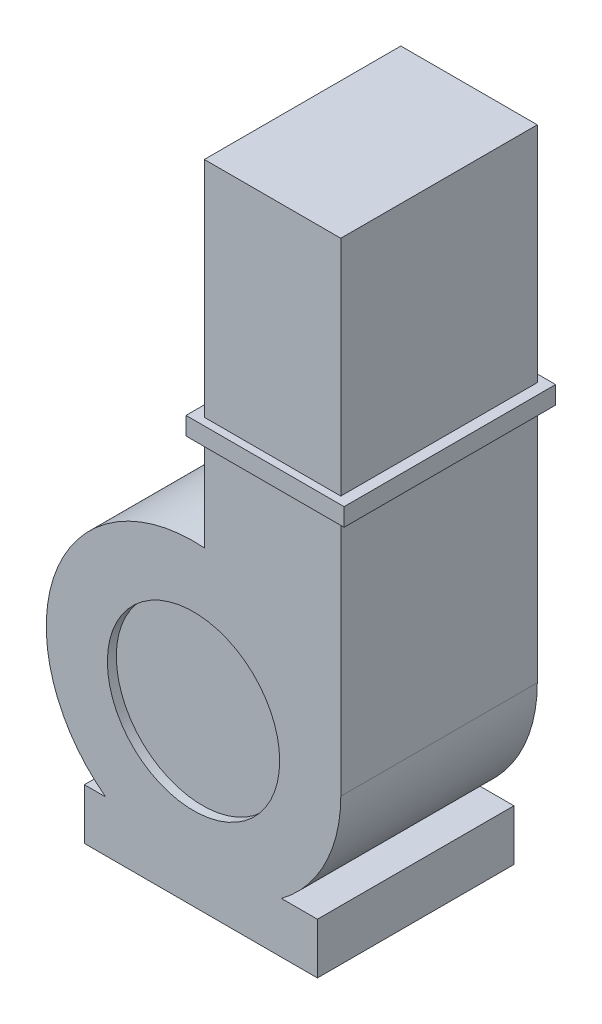
ISO-10303-21;
HEADER;
FILE_DESCRIPTION(('STEP AP214'),'2;1');
FILE_NAME('part.step','',(''),(''),'','','');
FILE_SCHEMA(('AUTOMOTIVE_DESIGN { 1 0 10303 214 1 1 1 1 }'));
ENDSEC;
DATA;
#1=APPLICATION_CONTEXT('core data for automotive mechanical design processes');
#2=APPLICATION_PROTOCOL_DEFINITION('international standard','automotive_design',2000,#1);
#3=PRODUCT_CONTEXT('',#1,'mechanical');
#4=PRODUCT('Part','Part','',(#3));
#5=PRODUCT_RELATED_PRODUCT_CATEGORY('part','',(#4));
#6=PRODUCT_DEFINITION_FORMATION('','',#4);
#7=PRODUCT_DEFINITION_CONTEXT('part definition',#1,'design');
#8=PRODUCT_DEFINITION('design','',#6,#7);
#9=PRODUCT_DEFINITION_SHAPE('','',#8);
#10=(LENGTH_UNIT() NAMED_UNIT(*) SI_UNIT(.MILLI.,.METRE.));
#11=(NAMED_UNIT(*) PLANE_ANGLE_UNIT() SI_UNIT($,.RADIAN.));
#12=(NAMED_UNIT(*) SI_UNIT($,.STERADIAN.) SOLID_ANGLE_UNIT());
#13=UNCERTAINTY_MEASURE_WITH_UNIT(LENGTH_MEASURE(1.E-05),#10,'distance_accuracy_value','');
#14=(GEOMETRIC_REPRESENTATION_CONTEXT(3) GLOBAL_UNCERTAINTY_ASSIGNED_CONTEXT((#13)) GLOBAL_UNIT_ASSIGNED_CONTEXT((#10,
#11,#12)) REPRESENTATION_CONTEXT('',''));
#15=CARTESIAN_POINT('',(0.,0.,0.));
#16=DIRECTION('',(0.,0.,1.));
#17=DIRECTION('',(1.,0.,0.));
#18=AXIS2_PLACEMENT_3D('',#15,#16,#17);
#19=CARTESIAN_POINT('',(16.4876424286667,45.5916168664445,11.));
#20=DIRECTION('',(-1.,0.,0.));
#21=DIRECTION('',(0.,0.,1.));
#22=AXIS2_PLACEMENT_3D('',#19,#20,#21);
#23=PLANE('',#22);
#24=DIRECTION('',(0.,0.,-1.));
#25=VECTOR('',#24,1.);
#26=CARTESIAN_POINT('',(16.4876424286667,20.5916168664445,11.));
#27=LINE('',#26,#25);
#28=CARTESIAN_POINT('',(16.4876424286667,20.5916168664445,11.));
#29=VERTEX_POINT('',#28);
#30=CARTESIAN_POINT('',(16.4876424286667,20.5916168664445,-11.));
#31=VERTEX_POINT('',#30);
#32=EDGE_CURVE('E113',#29,#31,#27,.T.);
#33=ORIENTED_EDGE('',*,*,#32,.T.);
#34=DIRECTION('',(0.,-1.,0.));
#35=VECTOR('',#34,1.);
#36=CARTESIAN_POINT('',(16.4876424286667,45.5916168664445,-11.));
#37=LINE('',#36,#35);
#38=CARTESIAN_POINT('',(16.4876424286667,45.5916168664445,-11.));
#39=VERTEX_POINT('',#38);
#40=EDGE_CURVE('E12',#39,#31,#37,.T.);
#41=ORIENTED_EDGE('',*,*,#40,.F.);
#42=DIRECTION('',(0.,0.,-1.));
#43=VECTOR('',#42,1.);
#44=CARTESIAN_POINT('',(16.4876424286667,45.5916168664445,11.));
#45=LINE('',#44,#43);
#46=CARTESIAN_POINT('',(16.4876424286667,45.5916168664445,11.));
#47=VERTEX_POINT('',#46);
#48=EDGE_CURVE('E101',#47,#39,#45,.T.);
#49=ORIENTED_EDGE('',*,*,#48,.F.);
#50=DIRECTION('',(0.,-1.,0.));
#51=VECTOR('',#50,1.);
#52=CARTESIAN_POINT('',(16.4876424286667,45.5916168664445,11.));
#53=LINE('',#52,#51);
#54=EDGE_CURVE('E109',#47,#29,#53,.T.);
#55=ORIENTED_EDGE('',*,*,#54,.T.);
#56=EDGE_LOOP('',(#33,#41,#49,#55));
#57=FACE_BOUND('',#56,.T.);
#58=ADVANCED_FACE('F50',(#57),#23,.F.);
#59=CARTESIAN_POINT('',(16.4876424286667,45.5916168664445,-11.));
#60=DIRECTION('',(0.,0.,1.));
#61=DIRECTION('',(1.,0.,0.));
#62=AXIS2_PLACEMENT_3D('',#59,#60,#61);
#63=PLANE('',#62);
#64=DIRECTION('',(-1.,0.,0.));
#65=VECTOR('',#64,1.);
#66=CARTESIAN_POINT('',(16.4876424286667,20.5916168664445,-11.));
#67=LINE('',#66,#65);
#68=CARTESIAN_POINT('',(1.20857616522223,20.5916168664445,-11.));
#69=VERTEX_POINT('',#68);
#70=EDGE_CURVE('E105',#31,#69,#67,.T.);
#71=ORIENTED_EDGE('',*,*,#70,.T.);
#72=DIRECTION('',(0.,-1.,0.));
#73=VECTOR('',#72,1.);
#74=CARTESIAN_POINT('',(1.20857616522223,45.5916168664445,-11.));
#75=LINE('',#74,#73);
#76=CARTESIAN_POINT('',(1.20857616522223,45.5916168664445,-11.));
#77=VERTEX_POINT('',#76);
#78=EDGE_CURVE('E58',#77,#69,#75,.T.);
#79=ORIENTED_EDGE('',*,*,#78,.F.);
#80=DIRECTION('',(-1.,0.,0.));
#81=VECTOR('',#80,1.);
#82=CARTESIAN_POINT('',(16.4876424286667,45.5916168664445,-11.));
#83=LINE('',#82,#81);
#84=EDGE_CURVE('E96',#39,#77,#83,.T.);
#85=ORIENTED_EDGE('',*,*,#84,.F.);
#86=ORIENTED_EDGE('',*,*,#40,.T.);
#87=EDGE_LOOP('',(#71,#79,#85,#86));
#88=FACE_BOUND('',#87,.T.);
#89=ADVANCED_FACE('F104',(#88),#63,.F.);
#90=CARTESIAN_POINT('',(1.20857616522223,45.5916168664445,-11.));
#91=DIRECTION('',(1.,0.,0.));
#92=DIRECTION('',(0.,0.,-1.));
#93=AXIS2_PLACEMENT_3D('',#90,#91,#92);
#94=PLANE('',#93);
#95=DIRECTION('',(0.,0.,1.));
#96=VECTOR('',#95,1.);
#97=CARTESIAN_POINT('',(1.20857616522223,20.5916168664445,-11.));
#98=LINE('',#97,#96);
#99=CARTESIAN_POINT('',(1.20857616522223,20.5916168664445,11.));
#100=VERTEX_POINT('',#99);
#101=EDGE_CURVE('E83',#69,#100,#98,.T.);
#102=ORIENTED_EDGE('',*,*,#101,.T.);
#103=DIRECTION('',(0.,-1.,0.));
#104=VECTOR('',#103,1.);
#105=CARTESIAN_POINT('',(1.20857616522223,45.5916168664445,11.));
#106=LINE('',#105,#104);
#107=CARTESIAN_POINT('',(1.20857616522223,45.5916168664445,11.));
#108=VERTEX_POINT('',#107);
#109=EDGE_CURVE('E106',#108,#100,#106,.T.);
#110=ORIENTED_EDGE('',*,*,#109,.F.);
#111=DIRECTION('',(0.,0.,1.));
#112=VECTOR('',#111,1.);
#113=CARTESIAN_POINT('',(1.20857616522223,45.5916168664445,-11.));
#114=LINE('',#113,#112);
#115=EDGE_CURVE('E99',#77,#108,#114,.T.);
#116=ORIENTED_EDGE('',*,*,#115,.F.);
#117=ORIENTED_EDGE('',*,*,#78,.T.);
#118=EDGE_LOOP('',(#102,#110,#116,#117));
#119=FACE_BOUND('',#118,.T.);
#120=ADVANCED_FACE('F107',(#119),#94,.F.);
#121=CARTESIAN_POINT('',(1.20857616522223,45.5916168664445,11.));
#122=DIRECTION('',(0.,0.,-1.));
#123=DIRECTION('',(-1.,0.,0.));
#124=AXIS2_PLACEMENT_3D('',#121,#122,#123);
#125=PLANE('',#124);
#126=DIRECTION('',(1.,0.,0.));
#127=VECTOR('',#126,1.);
#128=CARTESIAN_POINT('',(1.20857616522223,20.5916168664445,11.));
#129=LINE('',#128,#127);
#130=EDGE_CURVE('E89',#100,#29,#129,.T.);
#131=ORIENTED_EDGE('',*,*,#130,.T.);
#132=ORIENTED_EDGE('',*,*,#54,.F.);
#133=DIRECTION('',(1.,0.,0.));
#134=VECTOR('',#133,1.);
#135=CARTESIAN_POINT('',(1.20857616522223,45.5916168664445,11.));
#136=LINE('',#135,#134);
#137=EDGE_CURVE('E66',#108,#47,#136,.T.);
#138=ORIENTED_EDGE('',*,*,#137,.F.);
#139=ORIENTED_EDGE('',*,*,#109,.T.);
#140=EDGE_LOOP('',(#131,#132,#138,#139));
#141=FACE_BOUND('',#140,.T.);
#142=ADVANCED_FACE('F120',(#141),#125,.F.);
#143=CARTESIAN_POINT('',(0.,45.5916168664445,0.));
#144=DIRECTION('',(0.,1.,0.));
#145=DIRECTION('',(0.,0.,1.));
#146=AXIS2_PLACEMENT_3D('',#143,#144,#145);
#147=PLANE('',#146);
#148=ORIENTED_EDGE('',*,*,#48,.T.);
#149=ORIENTED_EDGE('',*,*,#84,.T.);
#150=ORIENTED_EDGE('',*,*,#115,.T.);
#151=ORIENTED_EDGE('',*,*,#137,.T.);
#152=EDGE_LOOP('',(#148,#149,#150,#151));
#153=FACE_BOUND('',#152,.T.);
#154=ADVANCED_FACE('F97',(#153),#147,.T.);
#155=CARTESIAN_POINT('',(0.,20.5916168664445,0.));
#156=DIRECTION('',(0.,1.,0.));
#157=DIRECTION('',(0.,0.,1.));
#158=AXIS2_PLACEMENT_3D('',#155,#156,#157);
#159=PLANE('',#158);
#160=ORIENTED_EDGE('',*,*,#32,.F.);
#161=ORIENTED_EDGE('',*,*,#130,.F.);
#162=ORIENTED_EDGE('',*,*,#101,.F.);
#163=ORIENTED_EDGE('',*,*,#70,.F.);
#164=EDGE_LOOP('',(#160,#161,#162,#163));
#165=FACE_BOUND('',#164,.T.);
#166=ADVANCED_FACE('F123',(#165),#159,.F.);
#167=CLOSED_SHELL('',(#58,#89,#120,#142,#154,#166));
#168=MANIFOLD_SOLID_BREP('B2',#167);
#169=CARTESIAN_POINT('',(0.,20.5916168664445,0.));
#170=DIRECTION('',(0.,1.,0.));
#171=DIRECTION('',(0.,0.,1.));
#172=AXIS2_PLACEMENT_3D('',#169,#170,#171);
#173=PLANE('',#172);
#174=DIRECTION('',(0.,0.,1.));
#175=VECTOR('',#174,1.);
#176=CARTESIAN_POINT('',(0.,20.5916168664445,11.8406144421016));
#177=LINE('',#176,#175);
#178=CARTESIAN_POINT('',(0.,20.5916168664445,-11.8406144421016));
#179=VERTEX_POINT('',#178);
#180=CARTESIAN_POINT('',(0.,20.5916168664445,11.8406144421016));
#181=VERTEX_POINT('',#180);
#182=EDGE_CURVE('E284',#179,#181,#177,.T.);
#183=ORIENTED_EDGE('',*,*,#182,.T.);
#184=DIRECTION('',(1.,0.,0.));
#185=VECTOR('',#184,1.);
#186=CARTESIAN_POINT('',(17.6962185938889,20.5916168664445,11.8406144421016));
#187=LINE('',#186,#185);
#188=CARTESIAN_POINT('',(17.6962185938889,20.5916168664445,11.8406144421016));
#189=VERTEX_POINT('',#188);
#190=EDGE_CURVE('E287',#181,#189,#187,.T.);
#191=ORIENTED_EDGE('',*,*,#190,.T.);
#192=DIRECTION('',(0.,0.,-1.));
#193=VECTOR('',#192,1.);
#194=CARTESIAN_POINT('',(17.6962185938889,20.5916168664445,11.8406144421016));
#195=LINE('',#194,#193);
#196=CARTESIAN_POINT('',(17.6962185938889,20.5916168664445,-11.8406144421016));
#197=VERTEX_POINT('',#196);
#198=EDGE_CURVE('E290',#189,#197,#195,.T.);
#199=ORIENTED_EDGE('',*,*,#198,.T.);
#200=DIRECTION('',(-1.,0.,0.));
#201=VECTOR('',#200,1.);
#202=CARTESIAN_POINT('',(17.6962185938889,20.5916168664445,-11.8406144421016));
#203=LINE('',#202,#201);
#204=EDGE_CURVE('E292',#197,#179,#203,.T.);
#205=ORIENTED_EDGE('',*,*,#204,.T.);
#206=EDGE_LOOP('',(#183,#191,#199,#205));
#207=FACE_BOUND('',#206,.T.);
#208=DIRECTION('',(1.,0.,0.));
#209=VECTOR('',#208,1.);
#210=CARTESIAN_POINT('',(1.20857616522223,20.5916168664445,11.));
#211=LINE('',#210,#209);
#212=CARTESIAN_POINT('',(1.20857616522223,20.5916168664445,11.));
#213=VERTEX_POINT('',#212);
#214=CARTESIAN_POINT('',(16.4876424286667,20.5916168664445,11.));
#215=VERTEX_POINT('',#214);
#216=EDGE_CURVE('E256',#213,#215,#211,.T.);
#217=ORIENTED_EDGE('',*,*,#216,.F.);
#218=DIRECTION('',(0.,0.,1.));
#219=VECTOR('',#218,1.);
#220=CARTESIAN_POINT('',(1.20857616522223,20.5916168664445,-11.));
#221=LINE('',#220,#219);
#222=CARTESIAN_POINT('',(1.20857616522223,20.5916168664445,-11.));
#223=VERTEX_POINT('',#222);
#224=EDGE_CURVE('E248',#223,#213,#221,.T.);
#225=ORIENTED_EDGE('',*,*,#224,.F.);
#226=DIRECTION('',(-1.,0.,0.));
#227=VECTOR('',#226,1.);
#228=CARTESIAN_POINT('',(1.20857616522223,20.5916168664445,-11.));
#229=LINE('',#228,#227);
#230=CARTESIAN_POINT('',(16.4876424286667,20.5916168664445,-11.));
#231=VERTEX_POINT('',#230);
#232=EDGE_CURVE('E270',#231,#223,#229,.T.);
#233=ORIENTED_EDGE('',*,*,#232,.F.);
#234=DIRECTION('',(0.,0.,-1.));
#235=VECTOR('',#234,1.);
#236=CARTESIAN_POINT('',(16.4876424286667,20.5916168664445,-11.));
#237=LINE('',#236,#235);
#238=EDGE_CURVE('E268',#215,#231,#237,.T.);
#239=ORIENTED_EDGE('',*,*,#238,.F.);
#240=EDGE_LOOP('',(#217,#225,#233,#239));
#241=FACE_BOUND('',#240,.T.);
#242=ADVANCED_FACE('F183',(#207,#241),#173,.T.);
#243=CARTESIAN_POINT('',(0.,18.5916168664445,0.));
#244=DIRECTION('',(0.,1.,0.));
#245=DIRECTION('',(0.,0.,1.));
#246=AXIS2_PLACEMENT_3D('',#243,#244,#245);
#247=PLANE('',#246);
#248=DIRECTION('',(0.,0.,1.));
#249=VECTOR('',#248,1.);
#250=CARTESIAN_POINT('',(0.,18.5916168664445,11.8406144421016));
#251=LINE('',#250,#249);
#252=CARTESIAN_POINT('',(0.,18.5916168664445,-11.8406144421016));
#253=VERTEX_POINT('',#252);
#254=CARTESIAN_POINT('',(0.,18.5916168664445,11.8406144421016));
#255=VERTEX_POINT('',#254);
#256=EDGE_CURVE('E264',#253,#255,#251,.T.);
#257=ORIENTED_EDGE('',*,*,#256,.F.);
#258=DIRECTION('',(-1.,0.,0.));
#259=VECTOR('',#258,1.);
#260=CARTESIAN_POINT('',(17.6962185938889,18.5916168664445,-11.8406144421016));
#261=LINE('',#260,#259);
#262=CARTESIAN_POINT('',(17.6962185938889,18.5916168664445,-11.8406144421016));
#263=VERTEX_POINT('',#262);
#264=EDGE_CURVE('E288',#263,#253,#261,.T.);
#265=ORIENTED_EDGE('',*,*,#264,.F.);
#266=DIRECTION('',(0.,0.,-1.));
#267=VECTOR('',#266,1.);
#268=CARTESIAN_POINT('',(17.6962185938889,18.5916168664445,11.8406144421016));
#269=LINE('',#268,#267);
#270=CARTESIAN_POINT('',(17.6962185938889,18.5916168664445,11.8406144421016));
#271=VERTEX_POINT('',#270);
#272=EDGE_CURVE('E299',#271,#263,#269,.T.);
#273=ORIENTED_EDGE('',*,*,#272,.F.);
#274=DIRECTION('',(1.,0.,0.));
#275=VECTOR('',#274,1.);
#276=CARTESIAN_POINT('',(17.6962185938889,18.5916168664445,11.8406144421016));
#277=LINE('',#276,#275);
#278=EDGE_CURVE('E297',#255,#271,#277,.T.);
#279=ORIENTED_EDGE('',*,*,#278,.F.);
#280=EDGE_LOOP('',(#257,#265,#273,#279));
#281=FACE_BOUND('',#280,.T.);
#282=DIRECTION('',(0.,0.,1.));
#283=VECTOR('',#282,1.);
#284=CARTESIAN_POINT('',(1.20857616522223,18.5916168664445,-11.));
#285=LINE('',#284,#283);
#286=CARTESIAN_POINT('',(1.20857616522223,18.5916168664445,-11.));
#287=VERTEX_POINT('',#286);
#288=CARTESIAN_POINT('',(1.20857616522223,18.5916168664445,11.));
#289=VERTEX_POINT('',#288);
#290=EDGE_CURVE('E206',#287,#289,#285,.T.);
#291=ORIENTED_EDGE('',*,*,#290,.T.);
#292=DIRECTION('',(1.,0.,0.));
#293=VECTOR('',#292,1.);
#294=CARTESIAN_POINT('',(1.20857616522223,18.5916168664445,11.));
#295=LINE('',#294,#293);
#296=CARTESIAN_POINT('',(16.4876424286667,18.5916168664445,11.));
#297=VERTEX_POINT('',#296);
#298=EDGE_CURVE('E263',#289,#297,#295,.T.);
#299=ORIENTED_EDGE('',*,*,#298,.T.);
#300=DIRECTION('',(0.,0.,-1.));
#301=VECTOR('',#300,1.);
#302=CARTESIAN_POINT('',(16.4876424286667,18.5916168664445,-11.));
#303=LINE('',#302,#301);
#304=CARTESIAN_POINT('',(16.4876424286667,18.5916168664445,-11.));
#305=VERTEX_POINT('',#304);
#306=EDGE_CURVE('E276',#297,#305,#303,.T.);
#307=ORIENTED_EDGE('',*,*,#306,.T.);
#308=DIRECTION('',(-1.,0.,0.));
#309=VECTOR('',#308,1.);
#310=CARTESIAN_POINT('',(1.20857616522223,18.5916168664445,-11.));
#311=LINE('',#310,#309);
#312=EDGE_CURVE('E257',#305,#287,#311,.T.);
#313=ORIENTED_EDGE('',*,*,#312,.T.);
#314=EDGE_LOOP('',(#291,#299,#307,#313));
#315=FACE_BOUND('',#314,.T.);
#316=ADVANCED_FACE('F317',(#281,#315),#247,.F.);
#317=CARTESIAN_POINT('',(0.,20.5916168664445,11.8406144421016));
#318=DIRECTION('',(1.,0.,0.));
#319=DIRECTION('',(0.,0.,-1.));
#320=AXIS2_PLACEMENT_3D('',#317,#318,#319);
#321=PLANE('',#320);
#322=ORIENTED_EDGE('',*,*,#256,.T.);
#323=DIRECTION('',(0.,-1.,0.));
#324=VECTOR('',#323,1.);
#325=CARTESIAN_POINT('',(0.,20.5916168664445,11.8406144421016));
#326=LINE('',#325,#324);
#327=EDGE_CURVE('E48',#181,#255,#326,.T.);
#328=ORIENTED_EDGE('',*,*,#327,.F.);
#329=ORIENTED_EDGE('',*,*,#182,.F.);
#330=DIRECTION('',(0.,-1.,0.));
#331=VECTOR('',#330,1.);
#332=CARTESIAN_POINT('',(0.,20.5916168664445,-11.8406144421016));
#333=LINE('',#332,#331);
#334=EDGE_CURVE('E294',#179,#253,#333,.T.);
#335=ORIENTED_EDGE('',*,*,#334,.T.);
#336=EDGE_LOOP('',(#322,#328,#329,#335));
#337=FACE_BOUND('',#336,.T.);
#338=ADVANCED_FACE('F185',(#337),#321,.F.);
#339=CARTESIAN_POINT('',(17.6962185938889,20.5916168664445,11.8406144421016));
#340=DIRECTION('',(0.,0.,-1.));
#341=DIRECTION('',(-1.,0.,0.));
#342=AXIS2_PLACEMENT_3D('',#339,#340,#341);
#343=PLANE('',#342);
#344=ORIENTED_EDGE('',*,*,#278,.T.);
#345=DIRECTION('',(0.,-1.,0.));
#346=VECTOR('',#345,1.);
#347=CARTESIAN_POINT('',(17.6962185938889,20.5916168664445,11.8406144421016));
#348=LINE('',#347,#346);
#349=EDGE_CURVE('E191',#189,#271,#348,.T.);
#350=ORIENTED_EDGE('',*,*,#349,.F.);
#351=ORIENTED_EDGE('',*,*,#190,.F.);
#352=ORIENTED_EDGE('',*,*,#327,.T.);
#353=EDGE_LOOP('',(#344,#350,#351,#352));
#354=FACE_BOUND('',#353,.T.);
#355=ADVANCED_FACE('F327',(#354),#343,.F.);
#356=CARTESIAN_POINT('',(17.6962185938889,20.5916168664445,11.8406144421016));
#357=DIRECTION('',(-1.,0.,0.));
#358=DIRECTION('',(0.,0.,1.));
#359=AXIS2_PLACEMENT_3D('',#356,#357,#358);
#360=PLANE('',#359);
#361=ORIENTED_EDGE('',*,*,#272,.T.);
#362=DIRECTION('',(0.,-1.,0.));
#363=VECTOR('',#362,1.);
#364=CARTESIAN_POINT('',(17.6962185938889,20.5916168664445,-11.8406144421016));
#365=LINE('',#364,#363);
#366=EDGE_CURVE('E304',#197,#263,#365,.T.);
#367=ORIENTED_EDGE('',*,*,#366,.F.);
#368=ORIENTED_EDGE('',*,*,#198,.F.);
#369=ORIENTED_EDGE('',*,*,#349,.T.);
#370=EDGE_LOOP('',(#361,#367,#368,#369));
#371=FACE_BOUND('',#370,.T.);
#372=ADVANCED_FACE('F311',(#371),#360,.F.);
#373=CARTESIAN_POINT('',(17.6962185938889,20.5916168664445,-11.8406144421016));
#374=DIRECTION('',(0.,0.,1.));
#375=DIRECTION('',(1.,0.,0.));
#376=AXIS2_PLACEMENT_3D('',#373,#374,#375);
#377=PLANE('',#376);
#378=ORIENTED_EDGE('',*,*,#264,.T.);
#379=ORIENTED_EDGE('',*,*,#334,.F.);
#380=ORIENTED_EDGE('',*,*,#204,.F.);
#381=ORIENTED_EDGE('',*,*,#366,.T.);
#382=EDGE_LOOP('',(#378,#379,#380,#381));
#383=FACE_BOUND('',#382,.T.);
#384=ADVANCED_FACE('F321',(#383),#377,.F.);
#385=CARTESIAN_POINT('',(1.20857616522223,20.5916168664445,-11.));
#386=DIRECTION('',(1.,0.,0.));
#387=DIRECTION('',(0.,0.,-1.));
#388=AXIS2_PLACEMENT_3D('',#385,#386,#387);
#389=PLANE('',#388);
#390=ORIENTED_EDGE('',*,*,#290,.F.);
#391=DIRECTION('',(0.,-1.,0.));
#392=VECTOR('',#391,1.);
#393=CARTESIAN_POINT('',(1.20857616522223,20.5916168664445,-11.));
#394=LINE('',#393,#392);
#395=EDGE_CURVE('E252',#223,#287,#394,.T.);
#396=ORIENTED_EDGE('',*,*,#395,.F.);
#397=ORIENTED_EDGE('',*,*,#224,.T.);
#398=DIRECTION('',(0.,-1.,0.));
#399=VECTOR('',#398,1.);
#400=CARTESIAN_POINT('',(1.20857616522223,20.5916168664445,11.));
#401=LINE('',#400,#399);
#402=EDGE_CURVE('E251',#213,#289,#401,.T.);
#403=ORIENTED_EDGE('',*,*,#402,.T.);
#404=EDGE_LOOP('',(#390,#396,#397,#403));
#405=FACE_BOUND('',#404,.T.);
#406=ADVANCED_FACE('F250',(#405),#389,.T.);
#407=CARTESIAN_POINT('',(1.20857616522223,20.5916168664445,11.));
#408=DIRECTION('',(0.,0.,-1.));
#409=DIRECTION('',(-1.,0.,0.));
#410=AXIS2_PLACEMENT_3D('',#407,#408,#409);
#411=PLANE('',#410);
#412=ORIENTED_EDGE('',*,*,#298,.F.);
#413=ORIENTED_EDGE('',*,*,#402,.F.);
#414=ORIENTED_EDGE('',*,*,#216,.T.);
#415=DIRECTION('',(0.,-1.,0.));
#416=VECTOR('',#415,1.);
#417=CARTESIAN_POINT('',(16.4876424286667,20.5916168664445,11.));
#418=LINE('',#417,#416);
#419=EDGE_CURVE('E265',#215,#297,#418,.T.);
#420=ORIENTED_EDGE('',*,*,#419,.T.);
#421=EDGE_LOOP('',(#412,#413,#414,#420));
#422=FACE_BOUND('',#421,.T.);
#423=ADVANCED_FACE('F260',(#422),#411,.T.);
#424=CARTESIAN_POINT('',(16.4876424286667,20.5916168664445,-11.));
#425=DIRECTION('',(-1.,0.,0.));
#426=DIRECTION('',(0.,0.,1.));
#427=AXIS2_PLACEMENT_3D('',#424,#425,#426);
#428=PLANE('',#427);
#429=ORIENTED_EDGE('',*,*,#306,.F.);
#430=ORIENTED_EDGE('',*,*,#419,.F.);
#431=ORIENTED_EDGE('',*,*,#238,.T.);
#432=DIRECTION('',(0.,-1.,0.));
#433=VECTOR('',#432,1.);
#434=CARTESIAN_POINT('',(16.4876424286667,20.5916168664445,-11.));
#435=LINE('',#434,#433);
#436=EDGE_CURVE('E198',#231,#305,#435,.T.);
#437=ORIENTED_EDGE('',*,*,#436,.T.);
#438=EDGE_LOOP('',(#429,#430,#431,#437));
#439=FACE_BOUND('',#438,.T.);
#440=ADVANCED_FACE('F350',(#439),#428,.T.);
#441=CARTESIAN_POINT('',(1.20857616522223,20.5916168664445,-11.));
#442=DIRECTION('',(0.,0.,1.));
#443=DIRECTION('',(1.,0.,0.));
#444=AXIS2_PLACEMENT_3D('',#441,#442,#443);
#445=PLANE('',#444);
#446=ORIENTED_EDGE('',*,*,#312,.F.);
#447=ORIENTED_EDGE('',*,*,#436,.F.);
#448=ORIENTED_EDGE('',*,*,#232,.T.);
#449=ORIENTED_EDGE('',*,*,#395,.T.);
#450=EDGE_LOOP('',(#446,#447,#448,#449));
#451=FACE_BOUND('',#450,.T.);
#452=ADVANCED_FACE('F354',(#451),#445,.T.);
#453=CLOSED_SHELL('',(#242,#316,#338,#355,#372,#384,#406,#423,#440,#452));
#454=MANIFOLD_SOLID_BREP('B6',#453);
#455=CARTESIAN_POINT('',(0.,-8.51235757133334,11.));
#456=DIRECTION('',(0.,0.,-1.));
#457=DIRECTION('',(-1.,0.,0.));
#458=AXIS2_PLACEMENT_3D('',#455,#456,#457);
#459=CYLINDRICAL_SURFACE('',#458,16.4876424286667);
#460=CARTESIAN_POINT('',(0.,-8.51235757133334,11.));
#461=DIRECTION('',(0.,0.,1.));
#462=DIRECTION('',(1.,0.,0.));
#463=AXIS2_PLACEMENT_3D('',#460,#461,#462);
#464=CIRCLE('',#463,16.4876424286667);
#465=CARTESIAN_POINT('',(9.83703226549012,-21.7439541894016,11.));
#466=VERTEX_POINT('',#465);
#467=CARTESIAN_POINT('',(16.4876424286667,-8.51235757133334,11.));
#468=VERTEX_POINT('',#467);
#469=EDGE_CURVE('E428',#466,#468,#464,.T.);
#470=ORIENTED_EDGE('',*,*,#469,.F.);
#471=DIRECTION('',(0.,0.,-1.));
#472=VECTOR('',#471,1.);
#473=CARTESIAN_POINT('',(9.83703226549012,-21.7439541894016,11.));
#474=LINE('',#473,#472);
#475=CARTESIAN_POINT('',(9.83703226549012,-21.7439541894016,-11.));
#476=VERTEX_POINT('',#475);
#477=EDGE_CURVE('E578',#466,#476,#474,.T.);
#478=ORIENTED_EDGE('',*,*,#477,.T.);
#479=CARTESIAN_POINT('',(0.,-8.51235757133334,-11.));
#480=DIRECTION('',(0.,0.,1.));
#481=DIRECTION('',(1.,0.,0.));
#482=AXIS2_PLACEMENT_3D('',#479,#480,#481);
#483=CIRCLE('',#482,16.4876424286667);
#484=CARTESIAN_POINT('',(16.4876424286667,-8.51235757133334,-11.));
#485=VERTEX_POINT('',#484);
#486=EDGE_CURVE('E643',#476,#485,#483,.T.);
#487=ORIENTED_EDGE('',*,*,#486,.T.);
#488=DIRECTION('',(0.,0.,-1.));
#489=VECTOR('',#488,1.);
#490=CARTESIAN_POINT('',(16.4876424286667,-8.51235757133334,11.));
#491=LINE('',#490,#489);
#492=EDGE_CURVE('E654',#468,#485,#491,.T.);
#493=ORIENTED_EDGE('',*,*,#492,.F.);
#494=EDGE_LOOP('',(#470,#478,#487,#493));
#495=FACE_BOUND('',#494,.T.);
#496=ADVANCED_FACE('F413',(#495),#459,.T.);
#497=CARTESIAN_POINT('',(0.,-8.51235757133334,11.));
#498=DIRECTION('',(0.,0.,-1.));
#499=DIRECTION('',(-1.,0.,0.));
#500=AXIS2_PLACEMENT_3D('',#497,#498,#499);
#501=CYLINDRICAL_SURFACE('',#500,14.4876424286667);
#502=DIRECTION('',(0.,0.,-1.));
#503=VECTOR('',#502,1.);
#504=CARTESIAN_POINT('',(5.9005621831845,-21.7439541894016,11.));
#505=LINE('',#504,#503);
#506=CARTESIAN_POINT('',(5.9005621831845,-21.7439541894016,9.));
#507=VERTEX_POINT('',#506);
#508=CARTESIAN_POINT('',(5.9005621831845,-21.7439541894016,-9.));
#509=VERTEX_POINT('',#508);
#510=EDGE_CURVE('E572',#507,#509,#505,.T.);
#511=ORIENTED_EDGE('',*,*,#510,.F.);
#512=CARTESIAN_POINT('',(0.,-8.51235757133334,9.));
#513=DIRECTION('',(0.,0.,1.));
#514=DIRECTION('',(1.,0.,0.));
#515=AXIS2_PLACEMENT_3D('',#512,#513,#514);
#516=CIRCLE('',#515,14.4876424286667);
#517=CARTESIAN_POINT('',(14.4876424286667,-8.51235757133334,9.));
#518=VERTEX_POINT('',#517);
#519=EDGE_CURVE('E594',#507,#518,#516,.T.);
#520=ORIENTED_EDGE('',*,*,#519,.T.);
#521=DIRECTION('',(0.,0.,-1.));
#522=VECTOR('',#521,1.);
#523=CARTESIAN_POINT('',(14.4876424286667,-8.51235757133334,11.));
#524=LINE('',#523,#522);
#525=CARTESIAN_POINT('',(14.4876424286667,-8.51235757133334,-9.));
#526=VERTEX_POINT('',#525);
#527=EDGE_CURVE('E590',#518,#526,#524,.T.);
#528=ORIENTED_EDGE('',*,*,#527,.T.);
#529=CARTESIAN_POINT('',(0.,-8.51235757133334,-9.));
#530=DIRECTION('',(0.,0.,1.));
#531=DIRECTION('',(1.,0.,0.));
#532=AXIS2_PLACEMENT_3D('',#529,#530,#531);
#533=CIRCLE('',#532,14.4876424286667);
#534=EDGE_CURVE('E584',#509,#526,#533,.T.);
#535=ORIENTED_EDGE('',*,*,#534,.F.);
#536=EDGE_LOOP('',(#511,#520,#528,#535));
#537=FACE_BOUND('',#536,.T.);
#538=ADVANCED_FACE('F701',(#537),#501,.F.);
#539=CARTESIAN_POINT('',(0.,18.5916168664445,11.));
#540=DIRECTION('',(0.,1.,0.));
#541=DIRECTION('',(0.,0.,1.));
#542=AXIS2_PLACEMENT_3D('',#539,#540,#541);
#543=PLANE('',#542);
#544=DIRECTION('',(1.,0.,0.));
#545=VECTOR('',#544,1.);
#546=CARTESIAN_POINT('',(0.,18.5916168664445,-11.));
#547=LINE('',#546,#545);
#548=CARTESIAN_POINT('',(1.20857616522223,18.5916168664445,-11.));
#549=VERTEX_POINT('',#548);
#550=CARTESIAN_POINT('',(16.4876424286667,18.5916168664445,-11.));
#551=VERTEX_POINT('',#550);
#552=EDGE_CURVE('E631',#549,#551,#547,.T.);
#553=ORIENTED_EDGE('',*,*,#552,.F.);
#554=DIRECTION('',(0.,0.,-1.));
#555=VECTOR('',#554,1.);
#556=CARTESIAN_POINT('',(1.20857616522223,18.5916168664445,11.));
#557=LINE('',#556,#555);
#558=CARTESIAN_POINT('',(1.20857616522223,18.5916168664445,11.));
#559=VERTEX_POINT('',#558);
#560=EDGE_CURVE('E640',#559,#549,#557,.T.);
#561=ORIENTED_EDGE('',*,*,#560,.F.);
#562=DIRECTION('',(1.,0.,0.));
#563=VECTOR('',#562,1.);
#564=CARTESIAN_POINT('',(0.,18.5916168664445,11.));
#565=LINE('',#564,#563);
#566=CARTESIAN_POINT('',(16.4876424286667,18.5916168664445,11.));
#567=VERTEX_POINT('',#566);
#568=EDGE_CURVE('E637',#559,#567,#565,.T.);
#569=ORIENTED_EDGE('',*,*,#568,.T.);
#570=DIRECTION('',(0.,0.,-1.));
#571=VECTOR('',#570,1.);
#572=CARTESIAN_POINT('',(16.4876424286667,18.5916168664445,11.));
#573=LINE('',#572,#571);
#574=EDGE_CURVE('E652',#567,#551,#573,.T.);
#575=ORIENTED_EDGE('',*,*,#574,.T.);
#576=EDGE_LOOP('',(#553,#561,#569,#575));
#577=FACE_BOUND('',#576,.T.);
#578=DIRECTION('',(0.,0.,-1.));
#579=VECTOR('',#578,1.);
#580=CARTESIAN_POINT('',(3.20857616522223,18.5916168664445,11.));
#581=LINE('',#580,#579);
#582=CARTESIAN_POINT('',(3.20857616522223,18.5916168664445,9.));
#583=VERTEX_POINT('',#582);
#584=CARTESIAN_POINT('',(3.20857616522223,18.5916168664445,-9.));
#585=VERTEX_POINT('',#584);
#586=EDGE_CURVE('E615',#583,#585,#581,.T.);
#587=ORIENTED_EDGE('',*,*,#586,.T.);
#588=DIRECTION('',(1.,0.,0.));
#589=VECTOR('',#588,1.);
#590=CARTESIAN_POINT('',(0.,18.5916168664445,-9.));
#591=LINE('',#590,#589);
#592=CARTESIAN_POINT('',(14.4876424286667,18.5916168664445,-9.));
#593=VERTEX_POINT('',#592);
#594=EDGE_CURVE('E595',#585,#593,#591,.T.);
#595=ORIENTED_EDGE('',*,*,#594,.T.);
#596=DIRECTION('',(0.,0.,-1.));
#597=VECTOR('',#596,1.);
#598=CARTESIAN_POINT('',(14.4876424286667,18.5916168664445,11.));
#599=LINE('',#598,#597);
#600=CARTESIAN_POINT('',(14.4876424286667,18.5916168664445,9.));
#601=VERTEX_POINT('',#600);
#602=EDGE_CURVE('E601',#601,#593,#599,.T.);
#603=ORIENTED_EDGE('',*,*,#602,.F.);
#604=DIRECTION('',(1.,0.,0.));
#605=VECTOR('',#604,1.);
#606=CARTESIAN_POINT('',(0.,18.5916168664445,9.));
#607=LINE('',#606,#605);
#608=EDGE_CURVE('E610',#583,#601,#607,.T.);
#609=ORIENTED_EDGE('',*,*,#608,.F.);
#610=EDGE_LOOP('',(#587,#595,#603,#609));
#611=FACE_BOUND('',#610,.T.);
#612=ADVANCED_FACE('F667',(#577,#611),#543,.T.);
#613=CARTESIAN_POINT('',(1.20857616522223,0.,11.));
#614=DIRECTION('',(1.,0.,0.));
#615=DIRECTION('',(0.,1.,0.));
#616=AXIS2_PLACEMENT_3D('',#613,#614,#615);
#617=PLANE('',#616);
#618=DIRECTION('',(0.,-1.,0.));
#619=VECTOR('',#618,1.);
#620=CARTESIAN_POINT('',(1.20857616522223,0.,-11.));
#621=LINE('',#620,#619);
#622=CARTESIAN_POINT('',(1.20857616522223,7.93092970671499,-11.));
#623=VERTEX_POINT('',#622);
#624=EDGE_CURVE('E625',#549,#623,#621,.T.);
#625=ORIENTED_EDGE('',*,*,#624,.T.);
#626=DIRECTION('',(0.,0.,-1.));
#627=VECTOR('',#626,1.);
#628=CARTESIAN_POINT('',(1.20857616522223,7.93092970671499,11.));
#629=LINE('',#628,#627);
#630=CARTESIAN_POINT('',(1.20857616522223,7.93092970671499,11.));
#631=VERTEX_POINT('',#630);
#632=EDGE_CURVE('E421',#631,#623,#629,.T.);
#633=ORIENTED_EDGE('',*,*,#632,.F.);
#634=DIRECTION('',(0.,-1.,0.));
#635=VECTOR('',#634,1.);
#636=CARTESIAN_POINT('',(1.20857616522223,0.,11.));
#637=LINE('',#636,#635);
#638=EDGE_CURVE('E628',#559,#631,#637,.T.);
#639=ORIENTED_EDGE('',*,*,#638,.F.);
#640=ORIENTED_EDGE('',*,*,#560,.T.);
#641=EDGE_LOOP('',(#625,#633,#639,#640));
#642=FACE_BOUND('',#641,.T.);
#643=ADVANCED_FACE('F415',(#642),#617,.F.);
#644=CARTESIAN_POINT('',(-9.83703226549012,-21.7439541894016,-11.));
#645=VERTEX_POINT('',#644);
#646=EDGE_CURVE('E644',#623,#645,#483,.T.);
#647=ORIENTED_EDGE('',*,*,#646,.T.);
#648=DIRECTION('',(0.,0.,-1.));
#649=VECTOR('',#648,1.);
#650=CARTESIAN_POINT('',(-9.83703226549012,-21.7439541894016,11.));
#651=LINE('',#650,#649);
#652=CARTESIAN_POINT('',(-9.83703226549012,-21.7439541894016,11.));
#653=VERTEX_POINT('',#652);
#654=EDGE_CURVE('E436',#645,#653,#651,.F.);
#655=ORIENTED_EDGE('',*,*,#654,.T.);
#656=EDGE_CURVE('E632',#631,#653,#464,.T.);
#657=ORIENTED_EDGE('',*,*,#656,.F.);
#658=ORIENTED_EDGE('',*,*,#632,.T.);
#659=EDGE_LOOP('',(#647,#655,#657,#658));
#660=FACE_BOUND('',#659,.T.);
#661=ADVANCED_FACE('F658',(#660),#459,.T.);
#662=CARTESIAN_POINT('',(16.4876424286667,0.,11.));
#663=DIRECTION('',(1.,0.,0.));
#664=DIRECTION('',(0.,0.,-1.));
#665=AXIS2_PLACEMENT_3D('',#662,#663,#664);
#666=PLANE('',#665);
#667=DIRECTION('',(0.,-1.,0.));
#668=VECTOR('',#667,1.);
#669=CARTESIAN_POINT('',(16.4876424286667,0.,-11.));
#670=LINE('',#669,#668);
#671=EDGE_CURVE('E646',#551,#485,#670,.T.);
#672=ORIENTED_EDGE('',*,*,#671,.F.);
#673=ORIENTED_EDGE('',*,*,#574,.F.);
#674=DIRECTION('',(0.,-1.,0.));
#675=VECTOR('',#674,1.);
#676=CARTESIAN_POINT('',(16.4876424286667,0.,11.));
#677=LINE('',#676,#675);
#678=EDGE_CURVE('E634',#567,#468,#677,.T.);
#679=ORIENTED_EDGE('',*,*,#678,.T.);
#680=ORIENTED_EDGE('',*,*,#492,.T.);
#681=EDGE_LOOP('',(#672,#673,#679,#680));
#682=FACE_BOUND('',#681,.T.);
#683=ADVANCED_FACE('F673',(#682),#666,.T.);
#684=CARTESIAN_POINT('',(0.,0.,11.));
#685=DIRECTION('',(0.,0.,1.));
#686=DIRECTION('',(1.,0.,0.));
#687=AXIS2_PLACEMENT_3D('',#684,#685,#686);
#688=PLANE('',#687);
#689=ORIENTED_EDGE('',*,*,#656,.T.);
#690=DIRECTION('',(-1.,0.,0.));
#691=VECTOR('',#690,1.);
#692=CARTESIAN_POINT('',(-12.2225101734335,-21.7439541894016,11.));
#693=LINE('',#692,#691);
#694=CARTESIAN_POINT('',(-12.2225101734335,-21.7439541894016,11.));
#695=VERTEX_POINT('',#694);
#696=EDGE_CURVE('E552',#653,#695,#693,.T.);
#697=ORIENTED_EDGE('',*,*,#696,.T.);
#698=DIRECTION('',(0.,-1.,0.));
#699=VECTOR('',#698,1.);
#700=CARTESIAN_POINT('',(-12.2225101734335,-21.7439541894016,11.));
#701=LINE('',#700,#699);
#702=CARTESIAN_POINT('',(-12.2225101734335,-27.4432145511712,11.));
#703=VERTEX_POINT('',#702);
#704=EDGE_CURVE('E533',#695,#703,#701,.T.);
#705=ORIENTED_EDGE('',*,*,#704,.T.);
#706=DIRECTION('',(1.,0.,0.));
#707=VECTOR('',#706,1.);
#708=CARTESIAN_POINT('',(-12.2225101734335,-27.4432145511712,11.));
#709=LINE('',#708,#707);
#710=CARTESIAN_POINT('',(13.8704890732223,-27.4432145511712,11.));
#711=VERTEX_POINT('',#710);
#712=EDGE_CURVE('E541',#703,#711,#709,.T.);
#713=ORIENTED_EDGE('',*,*,#712,.T.);
#714=DIRECTION('',(0.,1.,0.));
#715=VECTOR('',#714,1.);
#716=CARTESIAN_POINT('',(13.8704890732223,-21.7439541894016,11.));
#717=LINE('',#716,#715);
#718=CARTESIAN_POINT('',(13.8704890732223,-21.7439541894016,11.));
#719=VERTEX_POINT('',#718);
#720=EDGE_CURVE('E547',#711,#719,#717,.T.);
#721=ORIENTED_EDGE('',*,*,#720,.T.);
#722=EDGE_CURVE('E538',#719,#466,#693,.T.);
#723=ORIENTED_EDGE('',*,*,#722,.T.);
#724=ORIENTED_EDGE('',*,*,#469,.T.);
#725=ORIENTED_EDGE('',*,*,#678,.F.);
#726=ORIENTED_EDGE('',*,*,#568,.F.);
#727=ORIENTED_EDGE('',*,*,#638,.T.);
#728=EDGE_LOOP('',(#689,#697,#705,#713,#721,#723,#724,#725,#726,#727));
#729=FACE_BOUND('',#728,.T.);
#730=CARTESIAN_POINT('',(0.,-8.51235757133334,11.));
#731=DIRECTION('',(0.,0.,1.));
#732=DIRECTION('',(1.,0.,0.));
#733=AXIS2_PLACEMENT_3D('',#730,#731,#732);
#734=CIRCLE('',#733,9.6442759832579);
#735=CARTESIAN_POINT('',(9.6442759832579,-8.51235757133334,11.));
#736=VERTEX_POINT('',#735);
#737=EDGE_CURVE('E589',#736,#736,#734,.T.);
#738=ORIENTED_EDGE('',*,*,#737,.F.);
#739=EDGE_LOOP('',(#738));
#740=FACE_BOUND('',#739,.T.);
#741=ADVANCED_FACE('F549',(#729,#740),#688,.T.);
#742=CARTESIAN_POINT('',(0.,0.,-11.));
#743=DIRECTION('',(0.,0.,1.));
#744=DIRECTION('',(1.,0.,0.));
#745=AXIS2_PLACEMENT_3D('',#742,#743,#744);
#746=PLANE('',#745);
#747=ORIENTED_EDGE('',*,*,#486,.F.);
#748=DIRECTION('',(1.,0.,0.));
#749=VECTOR('',#748,1.);
#750=CARTESIAN_POINT('',(-12.2225101734335,-21.7439541894016,-11.));
#751=LINE('',#750,#749);
#752=CARTESIAN_POINT('',(13.8704890732223,-21.7439541894016,-11.));
#753=VERTEX_POINT('',#752);
#754=EDGE_CURVE('E675',#476,#753,#751,.T.);
#755=ORIENTED_EDGE('',*,*,#754,.T.);
#756=DIRECTION('',(0.,-1.,0.));
#757=VECTOR('',#756,1.);
#758=CARTESIAN_POINT('',(13.8704890732223,-21.7439541894016,-11.));
#759=LINE('',#758,#757);
#760=CARTESIAN_POINT('',(13.8704890732223,-27.4432145511712,-11.));
#761=VERTEX_POINT('',#760);
#762=EDGE_CURVE('E563',#753,#761,#759,.T.);
#763=ORIENTED_EDGE('',*,*,#762,.T.);
#764=DIRECTION('',(-1.,0.,0.));
#765=VECTOR('',#764,1.);
#766=CARTESIAN_POINT('',(-12.2225101734335,-27.4432145511712,-11.));
#767=LINE('',#766,#765);
#768=CARTESIAN_POINT('',(-12.2225101734335,-27.4432145511712,-11.));
#769=VERTEX_POINT('',#768);
#770=EDGE_CURVE('E567',#761,#769,#767,.T.);
#771=ORIENTED_EDGE('',*,*,#770,.T.);
#772=DIRECTION('',(0.,1.,0.));
#773=VECTOR('',#772,1.);
#774=CARTESIAN_POINT('',(-12.2225101734335,-21.7439541894016,-11.));
#775=LINE('',#774,#773);
#776=CARTESIAN_POINT('',(-12.2225101734335,-21.7439541894016,-11.));
#777=VERTEX_POINT('',#776);
#778=EDGE_CURVE('E534',#769,#777,#775,.T.);
#779=ORIENTED_EDGE('',*,*,#778,.T.);
#780=EDGE_CURVE('E681',#777,#645,#751,.T.);
#781=ORIENTED_EDGE('',*,*,#780,.T.);
#782=ORIENTED_EDGE('',*,*,#646,.F.);
#783=ORIENTED_EDGE('',*,*,#624,.F.);
#784=ORIENTED_EDGE('',*,*,#552,.T.);
#785=ORIENTED_EDGE('',*,*,#671,.T.);
#786=EDGE_LOOP('',(#747,#755,#763,#771,#779,#781,#782,#783,#784,#785));
#787=FACE_BOUND('',#786,.T.);
#788=ADVANCED_FACE('F664',(#787),#746,.F.);
#789=CARTESIAN_POINT('',(0.,-8.51235757133334,10.));
#790=DIRECTION('',(0.,0.,1.));
#791=DIRECTION('',(1.,0.,0.));
#792=AXIS2_PLACEMENT_3D('',#789,#790,#791);
#793=CYLINDRICAL_SURFACE('',#792,9.6442759832579);
#794=CARTESIAN_POINT('',(0.,-8.51235757133334,10.));
#795=DIRECTION('',(0.,0.,1.));
#796=DIRECTION('',(1.,0.,0.));
#797=AXIS2_PLACEMENT_3D('',#794,#795,#796);
#798=CIRCLE('',#797,9.6442759832579);
#799=CARTESIAN_POINT('',(9.6442759832579,-8.51235757133334,10.));
#800=VERTEX_POINT('',#799);
#801=EDGE_CURVE('E622',#800,#800,#798,.T.);
#802=ORIENTED_EDGE('',*,*,#801,.F.);
#803=EDGE_LOOP('',(#802));
#804=FACE_BOUND('',#803,.T.);
#805=ORIENTED_EDGE('',*,*,#737,.T.);
#806=EDGE_LOOP('',(#805));
#807=FACE_BOUND('',#806,.T.);
#808=ADVANCED_FACE('F723',(#804,#807),#793,.F.);
#809=CARTESIAN_POINT('',(0.,-8.51235757133334,10.));
#810=DIRECTION('',(0.,0.,1.));
#811=DIRECTION('',(1.,0.,0.));
#812=AXIS2_PLACEMENT_3D('',#809,#810,#811);
#813=PLANE('',#812);
#814=ORIENTED_EDGE('',*,*,#801,.T.);
#815=EDGE_LOOP('',(#814));
#816=FACE_BOUND('',#815,.T.);
#817=ADVANCED_FACE('F728',(#816),#813,.T.);
#818=CARTESIAN_POINT('',(3.20857616522223,0.,11.));
#819=DIRECTION('',(1.,0.,0.));
#820=DIRECTION('',(0.,1.,0.));
#821=AXIS2_PLACEMENT_3D('',#818,#819,#820);
#822=PLANE('',#821);
#823=DIRECTION('',(0.,-1.,0.));
#824=VECTOR('',#823,1.);
#825=CARTESIAN_POINT('',(3.20857616522223,0.,-9.));
#826=LINE('',#825,#824);
#827=CARTESIAN_POINT('',(3.20857616522223,5.61551637108526,-9.));
#828=VERTEX_POINT('',#827);
#829=EDGE_CURVE('E581',#585,#828,#826,.T.);
#830=ORIENTED_EDGE('',*,*,#829,.F.);
#831=ORIENTED_EDGE('',*,*,#586,.F.);
#832=DIRECTION('',(0.,-1.,0.));
#833=VECTOR('',#832,1.);
#834=CARTESIAN_POINT('',(3.20857616522223,0.,9.));
#835=LINE('',#834,#833);
#836=CARTESIAN_POINT('',(3.20857616522223,5.61551637108526,9.));
#837=VERTEX_POINT('',#836);
#838=EDGE_CURVE('E591',#583,#837,#835,.T.);
#839=ORIENTED_EDGE('',*,*,#838,.T.);
#840=DIRECTION('',(0.,0.,-1.));
#841=VECTOR('',#840,1.);
#842=CARTESIAN_POINT('',(3.20857616522223,5.61551637108526,9.));
#843=LINE('',#842,#841);
#844=EDGE_CURVE('E586',#837,#828,#843,.T.);
#845=ORIENTED_EDGE('',*,*,#844,.T.);
#846=EDGE_LOOP('',(#830,#831,#839,#845));
#847=FACE_BOUND('',#846,.T.);
#848=ADVANCED_FACE('F732',(#847),#822,.T.);
#849=DIRECTION('',(0.,0.,-1.));
#850=VECTOR('',#849,1.);
#851=CARTESIAN_POINT('',(-5.9005621831845,-21.7439541894016,11.));
#852=LINE('',#851,#850);
#853=CARTESIAN_POINT('',(-5.9005621831845,-21.7439541894016,-9.));
#854=VERTEX_POINT('',#853);
#855=CARTESIAN_POINT('',(-5.9005621831845,-21.7439541894016,9.));
#856=VERTEX_POINT('',#855);
#857=EDGE_CURVE('E569',#854,#856,#852,.F.);
#858=ORIENTED_EDGE('',*,*,#857,.F.);
#859=EDGE_CURVE('E596',#828,#854,#533,.T.);
#860=ORIENTED_EDGE('',*,*,#859,.F.);
#861=ORIENTED_EDGE('',*,*,#844,.F.);
#862=EDGE_CURVE('E602',#837,#856,#516,.T.);
#863=ORIENTED_EDGE('',*,*,#862,.T.);
#864=EDGE_LOOP('',(#858,#860,#861,#863));
#865=FACE_BOUND('',#864,.T.);
#866=ADVANCED_FACE('F707',(#865),#501,.F.);
#867=CARTESIAN_POINT('',(14.4876424286667,0.,11.));
#868=DIRECTION('',(1.,0.,0.));
#869=DIRECTION('',(0.,0.,-1.));
#870=AXIS2_PLACEMENT_3D('',#867,#868,#869);
#871=PLANE('',#870);
#872=DIRECTION('',(0.,-1.,0.));
#873=VECTOR('',#872,1.);
#874=CARTESIAN_POINT('',(14.4876424286667,0.,-9.));
#875=LINE('',#874,#873);
#876=EDGE_CURVE('E598',#593,#526,#875,.T.);
#877=ORIENTED_EDGE('',*,*,#876,.T.);
#878=ORIENTED_EDGE('',*,*,#527,.F.);
#879=DIRECTION('',(0.,-1.,0.));
#880=VECTOR('',#879,1.);
#881=CARTESIAN_POINT('',(14.4876424286667,0.,9.));
#882=LINE('',#881,#880);
#883=EDGE_CURVE('E605',#601,#518,#882,.T.);
#884=ORIENTED_EDGE('',*,*,#883,.F.);
#885=ORIENTED_EDGE('',*,*,#602,.T.);
#886=EDGE_LOOP('',(#877,#878,#884,#885));
#887=FACE_BOUND('',#886,.T.);
#888=ADVANCED_FACE('F748',(#887),#871,.F.);
#889=CARTESIAN_POINT('',(0.,0.,9.));
#890=DIRECTION('',(0.,0.,1.));
#891=DIRECTION('',(1.,0.,0.));
#892=AXIS2_PLACEMENT_3D('',#889,#890,#891);
#893=PLANE('',#892);
#894=CARTESIAN_POINT('',(0.,-8.51235757133334,9.));
#895=DIRECTION('',(0.,0.,1.));
#896=DIRECTION('',(1.,0.,0.));
#897=AXIS2_PLACEMENT_3D('',#894,#895,#896);
#898=CIRCLE('',#897,11.6442759832579);
#899=CARTESIAN_POINT('',(11.6442759832579,-8.51235757133334,9.));
#900=VERTEX_POINT('',#899);
#901=EDGE_CURVE('E580',#900,#900,#898,.T.);
#902=ORIENTED_EDGE('',*,*,#901,.T.);
#903=EDGE_LOOP('',(#902));
#904=FACE_BOUND('',#903,.T.);
#905=ORIENTED_EDGE('',*,*,#519,.F.);
#906=DIRECTION('',(-1.,0.,0.));
#907=VECTOR('',#906,1.);
#908=CARTESIAN_POINT('',(0.,-21.7439541894016,9.));
#909=LINE('',#908,#907);
#910=EDGE_CURVE('E575',#507,#856,#909,.T.);
#911=ORIENTED_EDGE('',*,*,#910,.T.);
#912=ORIENTED_EDGE('',*,*,#862,.F.);
#913=ORIENTED_EDGE('',*,*,#838,.F.);
#914=ORIENTED_EDGE('',*,*,#608,.T.);
#915=ORIENTED_EDGE('',*,*,#883,.T.);
#916=EDGE_LOOP('',(#905,#911,#912,#913,#914,#915));
#917=FACE_BOUND('',#916,.T.);
#918=ADVANCED_FACE('F744',(#904,#917),#893,.F.);
#919=CARTESIAN_POINT('',(0.,0.,-9.));
#920=DIRECTION('',(0.,0.,1.));
#921=DIRECTION('',(1.,0.,0.));
#922=AXIS2_PLACEMENT_3D('',#919,#920,#921);
#923=PLANE('',#922);
#924=DIRECTION('',(-1.,0.,0.));
#925=VECTOR('',#924,1.);
#926=CARTESIAN_POINT('',(0.,-21.7439541894016,-9.));
#927=LINE('',#926,#925);
#928=EDGE_CURVE('E181',#509,#854,#927,.T.);
#929=ORIENTED_EDGE('',*,*,#928,.F.);
#930=ORIENTED_EDGE('',*,*,#534,.T.);
#931=ORIENTED_EDGE('',*,*,#876,.F.);
#932=ORIENTED_EDGE('',*,*,#594,.F.);
#933=ORIENTED_EDGE('',*,*,#829,.T.);
#934=ORIENTED_EDGE('',*,*,#859,.T.);
#935=EDGE_LOOP('',(#929,#930,#931,#932,#933,#934));
#936=FACE_BOUND('',#935,.T.);
#937=ADVANCED_FACE('F740',(#936),#923,.T.);
#938=CARTESIAN_POINT('',(0.,-8.51235757133334,10.));
#939=DIRECTION('',(0.,0.,1.));
#940=DIRECTION('',(1.,0.,0.));
#941=AXIS2_PLACEMENT_3D('',#938,#939,#940);
#942=CYLINDRICAL_SURFACE('',#941,11.6442759832579);
#943=CARTESIAN_POINT('',(0.,-8.51235757133334,8.));
#944=DIRECTION('',(0.,0.,1.));
#945=DIRECTION('',(1.,0.,0.));
#946=AXIS2_PLACEMENT_3D('',#943,#944,#945);
#947=CIRCLE('',#946,11.6442759832579);
#948=CARTESIAN_POINT('',(11.6442759832579,-8.51235757133334,8.));
#949=VERTEX_POINT('',#948);
#950=EDGE_CURVE('E585',#949,#949,#947,.T.);
#951=ORIENTED_EDGE('',*,*,#950,.T.);
#952=EDGE_LOOP('',(#951));
#953=FACE_BOUND('',#952,.T.);
#954=ORIENTED_EDGE('',*,*,#901,.F.);
#955=EDGE_LOOP('',(#954));
#956=FACE_BOUND('',#955,.T.);
#957=ADVANCED_FACE('F736',(#953,#956),#942,.T.);
#958=CARTESIAN_POINT('',(0.,-8.51235757133334,8.));
#959=DIRECTION('',(0.,0.,1.));
#960=DIRECTION('',(1.,0.,0.));
#961=AXIS2_PLACEMENT_3D('',#958,#959,#960);
#962=PLANE('',#961);
#963=ORIENTED_EDGE('',*,*,#950,.F.);
#964=EDGE_LOOP('',(#963));
#965=FACE_BOUND('',#964,.T.);
#966=ADVANCED_FACE('F698',(#965),#962,.F.);
#967=CARTESIAN_POINT('',(-12.2225101734335,-21.7439541894016,-37.7081668850039));
#968=DIRECTION('',(0.,1.,0.));
#969=DIRECTION('',(0.,0.,1.));
#970=AXIS2_PLACEMENT_3D('',#967,#968,#969);
#971=PLANE('',#970);
#972=ORIENTED_EDGE('',*,*,#910,.F.);
#973=ORIENTED_EDGE('',*,*,#510,.T.);
#974=ORIENTED_EDGE('',*,*,#928,.T.);
#975=ORIENTED_EDGE('',*,*,#857,.T.);
#976=EDGE_LOOP('',(#972,#973,#974,#975));
#977=FACE_BOUND('',#976,.T.);
#978=ADVANCED_FACE('F690',(#977),#971,.T.);
#979=ORIENTED_EDGE('',*,*,#477,.F.);
#980=ORIENTED_EDGE('',*,*,#722,.F.);
#981=DIRECTION('',(0.,0.,1.));
#982=VECTOR('',#981,1.);
#983=CARTESIAN_POINT('',(13.8704890732223,-21.7439541894016,-37.7081668850039));
#984=LINE('',#983,#982);
#985=EDGE_CURVE('E564',#753,#719,#984,.T.);
#986=ORIENTED_EDGE('',*,*,#985,.F.);
#987=ORIENTED_EDGE('',*,*,#754,.F.);
#988=EDGE_LOOP('',(#979,#980,#986,#987));
#989=FACE_BOUND('',#988,.T.);
#990=ADVANCED_FACE('F680',(#989),#971,.T.);
#991=ORIENTED_EDGE('',*,*,#654,.F.);
#992=ORIENTED_EDGE('',*,*,#780,.F.);
#993=DIRECTION('',(0.,0.,1.));
#994=VECTOR('',#993,1.);
#995=CARTESIAN_POINT('',(-12.2225101734335,-21.7439541894016,-37.7081668850039));
#996=LINE('',#995,#994);
#997=EDGE_CURVE('E561',#777,#695,#996,.T.);
#998=ORIENTED_EDGE('',*,*,#997,.T.);
#999=ORIENTED_EDGE('',*,*,#696,.F.);
#1000=EDGE_LOOP('',(#991,#992,#998,#999));
#1001=FACE_BOUND('',#1000,.T.);
#1002=ADVANCED_FACE('F686',(#1001),#971,.T.);
#1003=CARTESIAN_POINT('',(-12.2225101734335,-21.7439541894016,-37.7081668850039));
#1004=DIRECTION('',(-1.,0.,0.));
#1005=DIRECTION('',(0.,0.,1.));
#1006=AXIS2_PLACEMENT_3D('',#1003,#1004,#1005);
#1007=PLANE('',#1006);
#1008=ORIENTED_EDGE('',*,*,#778,.F.);
#1009=DIRECTION('',(0.,0.,1.));
#1010=VECTOR('',#1009,1.);
#1011=CARTESIAN_POINT('',(-12.2225101734335,-27.4432145511712,-37.7081668850039));
#1012=LINE('',#1011,#1010);
#1013=EDGE_CURVE('E528',#769,#703,#1012,.T.);
#1014=ORIENTED_EDGE('',*,*,#1013,.T.);
#1015=ORIENTED_EDGE('',*,*,#704,.F.);
#1016=ORIENTED_EDGE('',*,*,#997,.F.);
#1017=EDGE_LOOP('',(#1008,#1014,#1015,#1016));
#1018=FACE_BOUND('',#1017,.T.);
#1019=ADVANCED_FACE('F530',(#1018),#1007,.T.);
#1020=CARTESIAN_POINT('',(13.8704890732223,-21.7439541894016,-37.7081668850039));
#1021=DIRECTION('',(1.,0.,0.));
#1022=DIRECTION('',(0.,0.,-1.));
#1023=AXIS2_PLACEMENT_3D('',#1020,#1021,#1022);
#1024=PLANE('',#1023);
#1025=ORIENTED_EDGE('',*,*,#762,.F.);
#1026=ORIENTED_EDGE('',*,*,#985,.T.);
#1027=ORIENTED_EDGE('',*,*,#720,.F.);
#1028=DIRECTION('',(0.,0.,1.));
#1029=VECTOR('',#1028,1.);
#1030=CARTESIAN_POINT('',(13.8704890732223,-27.4432145511712,-37.7081668850039));
#1031=LINE('',#1030,#1029);
#1032=EDGE_CURVE('E537',#761,#711,#1031,.T.);
#1033=ORIENTED_EDGE('',*,*,#1032,.F.);
#1034=EDGE_LOOP('',(#1025,#1026,#1027,#1033));
#1035=FACE_BOUND('',#1034,.T.);
#1036=ADVANCED_FACE('F684',(#1035),#1024,.T.);
#1037=CARTESIAN_POINT('',(-12.2225101734335,-27.4432145511712,-37.7081668850039));
#1038=DIRECTION('',(0.,-1.,0.));
#1039=DIRECTION('',(0.,0.,-1.));
#1040=AXIS2_PLACEMENT_3D('',#1037,#1038,#1039);
#1041=PLANE('',#1040);
#1042=ORIENTED_EDGE('',*,*,#770,.F.);
#1043=ORIENTED_EDGE('',*,*,#1032,.T.);
#1044=ORIENTED_EDGE('',*,*,#712,.F.);
#1045=ORIENTED_EDGE('',*,*,#1013,.F.);
#1046=EDGE_LOOP('',(#1042,#1043,#1044,#1045));
#1047=FACE_BOUND('',#1046,.T.);
#1048=ADVANCED_FACE('F542',(#1047),#1041,.T.);
#1049=CLOSED_SHELL('',(#496,#538,#612,#643,#661,#683,#741,#788,#808,#817,#848,#866,#888,#918,
#937,#957,#966,#978,#990,#1002,#1019,#1036,#1048));
#1050=MANIFOLD_SOLID_BREP('B42',#1049);
#1051=ADVANCED_BREP_SHAPE_REPRESENTATION('',(#18,#168,#454,#1050),#14);
#1052=SHAPE_DEFINITION_REPRESENTATION(#9,#1051);
ENDSEC;
END-ISO-10303-21;
